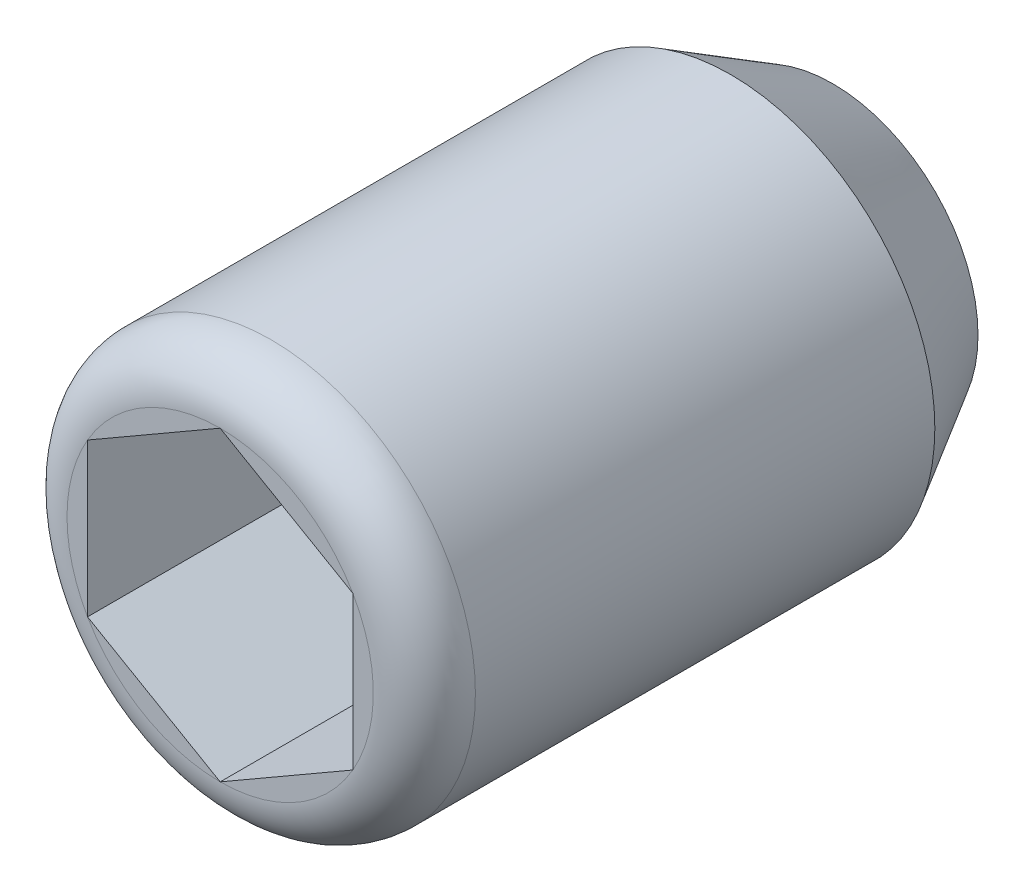
ISO-10303-21;
HEADER;
FILE_DESCRIPTION(('STEP AP214'),'2;1');
FILE_NAME('part.step','',(''),(''),'','','');
FILE_SCHEMA(('AUTOMOTIVE_DESIGN { 1 0 10303 214 1 1 1 1 }'));
ENDSEC;
DATA;
#1=APPLICATION_CONTEXT('core data for automotive mechanical design processes');
#2=APPLICATION_PROTOCOL_DEFINITION('international standard','automotive_design',2000,#1);
#3=PRODUCT_CONTEXT('',#1,'mechanical');
#4=PRODUCT('Part','Part','',(#3));
#5=PRODUCT_RELATED_PRODUCT_CATEGORY('part','',(#4));
#6=PRODUCT_DEFINITION_FORMATION('','',#4);
#7=PRODUCT_DEFINITION_CONTEXT('part definition',#1,'design');
#8=PRODUCT_DEFINITION('design','',#6,#7);
#9=PRODUCT_DEFINITION_SHAPE('','',#8);
#10=(LENGTH_UNIT() NAMED_UNIT(*) SI_UNIT(.MILLI.,.METRE.));
#11=(NAMED_UNIT(*) PLANE_ANGLE_UNIT() SI_UNIT($,.RADIAN.));
#12=(NAMED_UNIT(*) SI_UNIT($,.STERADIAN.) SOLID_ANGLE_UNIT());
#13=UNCERTAINTY_MEASURE_WITH_UNIT(LENGTH_MEASURE(1.E-05),#10,'distance_accuracy_value','');
#14=(GEOMETRIC_REPRESENTATION_CONTEXT(3) GLOBAL_UNCERTAINTY_ASSIGNED_CONTEXT((#13)) GLOBAL_UNIT_ASSIGNED_CONTEXT((#10,
#11,#12)) REPRESENTATION_CONTEXT('',''));
#15=CARTESIAN_POINT('',(0.,0.,0.));
#16=DIRECTION('',(0.,0.,1.));
#17=DIRECTION('',(1.,0.,0.));
#18=AXIS2_PLACEMENT_3D('',#15,#16,#17);
#19=CARTESIAN_POINT('',(0.,0.,6.));
#20=DIRECTION('',(0.,0.,-1.));
#21=DIRECTION('',(0.,-1.,0.));
#22=AXIS2_PLACEMENT_3D('',#19,#20,#21);
#23=PLANE('',#22);
#24=DIRECTION('',(-0.866025403784439,0.5,0.));
#25=VECTOR('',#24,1.);
#26=CARTESIAN_POINT('',(1.29903810567666,0.75,6.));
#27=LINE('',#26,#25);
#28=CARTESIAN_POINT('',(1.29903810567666,0.75,6.));
#29=VERTEX_POINT('',#28);
#30=CARTESIAN_POINT('',(0.,1.5,6.));
#31=VERTEX_POINT('',#30);
#32=EDGE_CURVE('E39',#29,#31,#27,.T.);
#33=ORIENTED_EDGE('',*,*,#32,.F.);
#34=CARTESIAN_POINT('',(0.,0.,6.));
#35=DIRECTION('',(0.,0.,1.));
#36=DIRECTION('',(-1.,0.,0.));
#37=AXIS2_PLACEMENT_3D('',#34,#35,#36);
#38=CIRCLE('',#37,1.5);
#39=EDGE_CURVE('E11',#29,#31,#38,.T.);
#40=ORIENTED_EDGE('',*,*,#39,.T.);
#41=EDGE_LOOP('',(#33,#40));
#42=FACE_BOUND('',#41,.T.);
#43=ADVANCED_FACE('F17',(#42),#23,.F.);
#44=CARTESIAN_POINT('',(0.,0.,6.));
#45=DIRECTION('',(0.,0.,-1.));
#46=DIRECTION('',(0.,-1.,0.));
#47=AXIS2_PLACEMENT_3D('',#44,#45,#46);
#48=PLANE('',#47);
#49=DIRECTION('',(-0.866025403784439,-0.5,0.));
#50=VECTOR('',#49,1.);
#51=CARTESIAN_POINT('',(0.,1.5,6.));
#52=LINE('',#51,#50);
#53=CARTESIAN_POINT('',(-1.29903810567665,0.75,6.));
#54=VERTEX_POINT('',#53);
#55=EDGE_CURVE('E163',#31,#54,#52,.T.);
#56=ORIENTED_EDGE('',*,*,#55,.F.);
#57=CARTESIAN_POINT('',(0.,0.,6.));
#58=DIRECTION('',(0.,0.,1.));
#59=DIRECTION('',(-1.,0.,0.));
#60=AXIS2_PLACEMENT_3D('',#57,#58,#59);
#61=CIRCLE('',#60,1.5);
#62=EDGE_CURVE('E21',#31,#54,#61,.T.);
#63=ORIENTED_EDGE('',*,*,#62,.T.);
#64=EDGE_LOOP('',(#56,#63));
#65=FACE_BOUND('',#64,.T.);
#66=ADVANCED_FACE('F221',(#65),#48,.F.);
#67=CARTESIAN_POINT('',(0.,0.,6.));
#68=DIRECTION('',(0.,0.,-1.));
#69=DIRECTION('',(0.,-1.,0.));
#70=AXIS2_PLACEMENT_3D('',#67,#68,#69);
#71=PLANE('',#70);
#72=DIRECTION('',(0.,-1.,0.));
#73=VECTOR('',#72,1.);
#74=CARTESIAN_POINT('',(-1.29903810567665,0.75,6.));
#75=LINE('',#74,#73);
#76=CARTESIAN_POINT('',(-1.29903810567665,-0.75,6.));
#77=VERTEX_POINT('',#76);
#78=EDGE_CURVE('E176',#54,#77,#75,.T.);
#79=ORIENTED_EDGE('',*,*,#78,.F.);
#80=CARTESIAN_POINT('',(0.,0.,6.));
#81=DIRECTION('',(0.,0.,1.));
#82=DIRECTION('',(-1.,0.,0.));
#83=AXIS2_PLACEMENT_3D('',#80,#81,#82);
#84=CIRCLE('',#83,1.5);
#85=EDGE_CURVE('E166',#54,#77,#84,.T.);
#86=ORIENTED_EDGE('',*,*,#85,.T.);
#87=EDGE_LOOP('',(#79,#86));
#88=FACE_BOUND('',#87,.T.);
#89=ADVANCED_FACE('F226',(#88),#71,.F.);
#90=CARTESIAN_POINT('',(0.,0.,6.));
#91=DIRECTION('',(0.,0.,-1.));
#92=DIRECTION('',(0.,-1.,0.));
#93=AXIS2_PLACEMENT_3D('',#90,#91,#92);
#94=PLANE('',#93);
#95=DIRECTION('',(0.866025403784439,-0.5,0.));
#96=VECTOR('',#95,1.);
#97=CARTESIAN_POINT('',(-1.29903810567665,-0.75,6.));
#98=LINE('',#97,#96);
#99=CARTESIAN_POINT('',(0.,-1.5,6.));
#100=VERTEX_POINT('',#99);
#101=EDGE_CURVE('E151',#77,#100,#98,.T.);
#102=ORIENTED_EDGE('',*,*,#101,.F.);
#103=CARTESIAN_POINT('',(0.,0.,6.));
#104=DIRECTION('',(0.,0.,1.));
#105=DIRECTION('',(-1.,0.,0.));
#106=AXIS2_PLACEMENT_3D('',#103,#104,#105);
#107=CIRCLE('',#106,1.5);
#108=EDGE_CURVE('E158',#77,#100,#107,.T.);
#109=ORIENTED_EDGE('',*,*,#108,.T.);
#110=EDGE_LOOP('',(#102,#109));
#111=FACE_BOUND('',#110,.T.);
#112=ADVANCED_FACE('F232',(#111),#94,.F.);
#113=CARTESIAN_POINT('',(0.,0.,6.));
#114=DIRECTION('',(0.,0.,-1.));
#115=DIRECTION('',(0.,-1.,0.));
#116=AXIS2_PLACEMENT_3D('',#113,#114,#115);
#117=PLANE('',#116);
#118=DIRECTION('',(0.866025403784438,0.5,0.));
#119=VECTOR('',#118,1.);
#120=CARTESIAN_POINT('',(0.,-1.5,6.));
#121=LINE('',#120,#119);
#122=CARTESIAN_POINT('',(1.29903810567666,-0.75,6.));
#123=VERTEX_POINT('',#122);
#124=EDGE_CURVE('E126',#100,#123,#121,.T.);
#125=ORIENTED_EDGE('',*,*,#124,.F.);
#126=CARTESIAN_POINT('',(0.,0.,6.));
#127=DIRECTION('',(0.,0.,1.));
#128=DIRECTION('',(-1.,0.,0.));
#129=AXIS2_PLACEMENT_3D('',#126,#127,#128);
#130=CIRCLE('',#129,1.5);
#131=EDGE_CURVE('E154',#100,#123,#130,.T.);
#132=ORIENTED_EDGE('',*,*,#131,.T.);
#133=EDGE_LOOP('',(#125,#132));
#134=FACE_BOUND('',#133,.T.);
#135=ADVANCED_FACE('F234',(#134),#117,.F.);
#136=CARTESIAN_POINT('',(0.,0.,6.));
#137=DIRECTION('',(0.,0.,-1.));
#138=DIRECTION('',(-1.,0.,0.));
#139=AXIS2_PLACEMENT_3D('',#136,#137,#138);
#140=CYLINDRICAL_SURFACE('',#139,2.);
#141=CARTESIAN_POINT('',(0.,0.,5.5));
#142=DIRECTION('',(0.,0.,-1.));
#143=DIRECTION('',(-1.,0.,0.));
#144=AXIS2_PLACEMENT_3D('',#141,#142,#143);
#145=CIRCLE('',#144,2.);
#146=CARTESIAN_POINT('',(-2.,0.,5.5));
#147=VERTEX_POINT('',#146);
#148=EDGE_CURVE('E107',#147,#147,#145,.T.);
#149=ORIENTED_EDGE('',*,*,#148,.T.);
#150=EDGE_LOOP('',(#149));
#151=FACE_BOUND('',#150,.T.);
#152=CARTESIAN_POINT('',(0.,0.,1.));
#153=DIRECTION('',(0.,0.,1.));
#154=DIRECTION('',(-1.,0.,0.));
#155=AXIS2_PLACEMENT_3D('',#152,#153,#154);
#156=CIRCLE('',#155,2.);
#157=CARTESIAN_POINT('',(-2.,0.,1.));
#158=VERTEX_POINT('',#157);
#159=EDGE_CURVE('E131',#158,#158,#156,.T.);
#160=ORIENTED_EDGE('',*,*,#159,.T.);
#161=EDGE_LOOP('',(#160));
#162=FACE_BOUND('',#161,.T.);
#163=ADVANCED_FACE('F19',(#151,#162),#140,.T.);
#164=CARTESIAN_POINT('',(0.,0.,6.));
#165=DIRECTION('',(0.,0.,-1.));
#166=DIRECTION('',(0.,-1.,0.));
#167=AXIS2_PLACEMENT_3D('',#164,#165,#166);
#168=PLANE('',#167);
#169=DIRECTION('',(0.,1.,0.));
#170=VECTOR('',#169,1.);
#171=CARTESIAN_POINT('',(1.29903810567666,-0.75,6.));
#172=LINE('',#171,#170);
#173=EDGE_CURVE('E98',#123,#29,#172,.T.);
#174=ORIENTED_EDGE('',*,*,#173,.F.);
#175=CARTESIAN_POINT('',(0.,0.,6.));
#176=DIRECTION('',(0.,0.,1.));
#177=DIRECTION('',(-1.,0.,0.));
#178=AXIS2_PLACEMENT_3D('',#175,#176,#177);
#179=CIRCLE('',#178,1.5);
#180=EDGE_CURVE('E125',#123,#29,#179,.T.);
#181=ORIENTED_EDGE('',*,*,#180,.T.);
#182=EDGE_LOOP('',(#174,#181));
#183=FACE_BOUND('',#182,.T.);
#184=ADVANCED_FACE('F217',(#183),#168,.F.);
#185=CARTESIAN_POINT('',(0.,0.,0.));
#186=DIRECTION('',(0.,0.,-1.));
#187=DIRECTION('',(0.,-1.,0.));
#188=AXIS2_PLACEMENT_3D('',#185,#186,#187);
#189=PLANE('',#188);
#190=CARTESIAN_POINT('',(0.,0.,0.));
#191=DIRECTION('',(0.,0.,-1.));
#192=DIRECTION('',(-1.,0.,0.));
#193=AXIS2_PLACEMENT_3D('',#190,#191,#192);
#194=CIRCLE('',#193,1.42264973081037);
#195=CARTESIAN_POINT('',(-1.42264973081037,0.,0.));
#196=VERTEX_POINT('',#195);
#197=EDGE_CURVE('E121',#196,#196,#194,.T.);
#198=ORIENTED_EDGE('',*,*,#197,.T.);
#199=EDGE_LOOP('',(#198));
#200=FACE_BOUND('',#199,.T.);
#201=ADVANCED_FACE('F209',(#200),#189,.T.);
#202=CARTESIAN_POINT('',(0.,0.,0.));
#203=DIRECTION('',(0.,0.,1.));
#204=DIRECTION('',(1.,0.,0.));
#205=AXIS2_PLACEMENT_3D('',#202,#203,#204);
#206=CONICAL_SURFACE('',#205,1.42264973081037,0.523598775598299);
#207=ORIENTED_EDGE('',*,*,#159,.F.);
#208=EDGE_LOOP('',(#207));
#209=FACE_BOUND('',#208,.T.);
#210=ORIENTED_EDGE('',*,*,#197,.F.);
#211=EDGE_LOOP('',(#210));
#212=FACE_BOUND('',#211,.T.);
#213=ADVANCED_FACE('F122',(#209,#212),#206,.T.);
#214=CARTESIAN_POINT('',(0.,-1.5,3.));
#215=DIRECTION('',(0.5,-0.866025403784438,0.));
#216=DIRECTION('',(0.,0.,-1.));
#217=AXIS2_PLACEMENT_3D('',#214,#215,#216);
#218=PLANE('',#217);
#219=ORIENTED_EDGE('',*,*,#124,.T.);
#220=DIRECTION('',(0.,0.,1.));
#221=VECTOR('',#220,1.);
#222=CARTESIAN_POINT('',(1.29903810567666,-0.75,3.));
#223=LINE('',#222,#221);
#224=CARTESIAN_POINT('',(1.29903810567666,-0.75,3.));
#225=VERTEX_POINT('',#224);
#226=EDGE_CURVE('E140',#225,#123,#223,.T.);
#227=ORIENTED_EDGE('',*,*,#226,.F.);
#228=DIRECTION('',(0.866025403784438,0.5,0.));
#229=VECTOR('',#228,1.);
#230=CARTESIAN_POINT('',(0.,-1.5,3.));
#231=LINE('',#230,#229);
#232=CARTESIAN_POINT('',(0.,-1.5,3.));
#233=VERTEX_POINT('',#232);
#234=EDGE_CURVE('E114',#233,#225,#231,.T.);
#235=ORIENTED_EDGE('',*,*,#234,.F.);
#236=DIRECTION('',(0.,0.,1.));
#237=VECTOR('',#236,1.);
#238=CARTESIAN_POINT('',(0.,-1.5,3.));
#239=LINE('',#238,#237);
#240=EDGE_CURVE('E134',#233,#100,#239,.T.);
#241=ORIENTED_EDGE('',*,*,#240,.T.);
#242=EDGE_LOOP('',(#219,#227,#235,#241));
#243=FACE_BOUND('',#242,.T.);
#244=ADVANCED_FACE('F208',(#243),#218,.F.);
#245=CARTESIAN_POINT('',(1.29903810567666,-0.75,3.));
#246=DIRECTION('',(1.,0.,0.));
#247=DIRECTION('',(0.,1.,0.));
#248=AXIS2_PLACEMENT_3D('',#245,#246,#247);
#249=PLANE('',#248);
#250=ORIENTED_EDGE('',*,*,#173,.T.);
#251=DIRECTION('',(0.,0.,1.));
#252=VECTOR('',#251,1.);
#253=CARTESIAN_POINT('',(1.29903810567666,0.75,3.));
#254=LINE('',#253,#252);
#255=CARTESIAN_POINT('',(1.29903810567666,0.75,3.));
#256=VERTEX_POINT('',#255);
#257=EDGE_CURVE('E159',#256,#29,#254,.T.);
#258=ORIENTED_EDGE('',*,*,#257,.F.);
#259=DIRECTION('',(0.,1.,0.));
#260=VECTOR('',#259,1.);
#261=CARTESIAN_POINT('',(1.29903810567666,-0.75,3.));
#262=LINE('',#261,#260);
#263=EDGE_CURVE('E139',#225,#256,#262,.T.);
#264=ORIENTED_EDGE('',*,*,#263,.F.);
#265=ORIENTED_EDGE('',*,*,#226,.T.);
#266=EDGE_LOOP('',(#250,#258,#264,#265));
#267=FACE_BOUND('',#266,.T.);
#268=ADVANCED_FACE('F214',(#267),#249,.F.);
#269=CARTESIAN_POINT('',(1.29903810567666,0.75,3.));
#270=DIRECTION('',(0.5,0.866025403784439,0.));
#271=DIRECTION('',(0.,0.,-1.));
#272=AXIS2_PLACEMENT_3D('',#269,#270,#271);
#273=PLANE('',#272);
#274=ORIENTED_EDGE('',*,*,#32,.T.);
#275=DIRECTION('',(0.,0.,1.));
#276=VECTOR('',#275,1.);
#277=CARTESIAN_POINT('',(0.,1.5,3.));
#278=LINE('',#277,#276);
#279=CARTESIAN_POINT('',(0.,1.5,3.));
#280=VERTEX_POINT('',#279);
#281=EDGE_CURVE('E183',#280,#31,#278,.T.);
#282=ORIENTED_EDGE('',*,*,#281,.F.);
#283=DIRECTION('',(-0.866025403784439,0.5,0.));
#284=VECTOR('',#283,1.);
#285=CARTESIAN_POINT('',(1.29903810567666,0.75,3.));
#286=LINE('',#285,#284);
#287=EDGE_CURVE('E90',#256,#280,#286,.T.);
#288=ORIENTED_EDGE('',*,*,#287,.F.);
#289=ORIENTED_EDGE('',*,*,#257,.T.);
#290=EDGE_LOOP('',(#274,#282,#288,#289));
#291=FACE_BOUND('',#290,.T.);
#292=ADVANCED_FACE('F268',(#291),#273,.F.);
#293=CARTESIAN_POINT('',(0.,1.5,3.));
#294=DIRECTION('',(-0.5,0.866025403784439,0.));
#295=DIRECTION('',(0.,0.,1.));
#296=AXIS2_PLACEMENT_3D('',#293,#294,#295);
#297=PLANE('',#296);
#298=ORIENTED_EDGE('',*,*,#55,.T.);
#299=DIRECTION('',(0.,0.,1.));
#300=VECTOR('',#299,1.);
#301=CARTESIAN_POINT('',(-1.29903810567665,0.75,3.));
#302=LINE('',#301,#300);
#303=CARTESIAN_POINT('',(-1.29903810567665,0.75,3.));
#304=VERTEX_POINT('',#303);
#305=EDGE_CURVE('E173',#304,#54,#302,.T.);
#306=ORIENTED_EDGE('',*,*,#305,.F.);
#307=DIRECTION('',(-0.866025403784439,-0.5,0.));
#308=VECTOR('',#307,1.);
#309=CARTESIAN_POINT('',(0.,1.5,3.));
#310=LINE('',#309,#308);
#311=EDGE_CURVE('E84',#280,#304,#310,.T.);
#312=ORIENTED_EDGE('',*,*,#311,.F.);
#313=ORIENTED_EDGE('',*,*,#281,.T.);
#314=EDGE_LOOP('',(#298,#306,#312,#313));
#315=FACE_BOUND('',#314,.T.);
#316=ADVANCED_FACE('F266',(#315),#297,.F.);
#317=CARTESIAN_POINT('',(-1.29903810567665,0.75,3.));
#318=DIRECTION('',(-1.,0.,0.));
#319=DIRECTION('',(0.,1.,0.));
#320=AXIS2_PLACEMENT_3D('',#317,#318,#319);
#321=PLANE('',#320);
#322=ORIENTED_EDGE('',*,*,#78,.T.);
#323=DIRECTION('',(0.,0.,1.));
#324=VECTOR('',#323,1.);
#325=CARTESIAN_POINT('',(-1.29903810567665,-0.75,3.));
#326=LINE('',#325,#324);
#327=CARTESIAN_POINT('',(-1.29903810567665,-0.75,3.));
#328=VERTEX_POINT('',#327);
#329=EDGE_CURVE('E138',#328,#77,#326,.T.);
#330=ORIENTED_EDGE('',*,*,#329,.F.);
#331=DIRECTION('',(0.,-1.,0.));
#332=VECTOR('',#331,1.);
#333=CARTESIAN_POINT('',(-1.29903810567665,0.75,3.));
#334=LINE('',#333,#332);
#335=EDGE_CURVE('E78',#304,#328,#334,.T.);
#336=ORIENTED_EDGE('',*,*,#335,.F.);
#337=ORIENTED_EDGE('',*,*,#305,.T.);
#338=EDGE_LOOP('',(#322,#330,#336,#337));
#339=FACE_BOUND('',#338,.T.);
#340=ADVANCED_FACE('F248',(#339),#321,.F.);
#341=CARTESIAN_POINT('',(-1.29903810567665,-0.75,3.));
#342=DIRECTION('',(-0.5,-0.866025403784439,0.));
#343=DIRECTION('',(-0.866025403784439,0.5,0.));
#344=AXIS2_PLACEMENT_3D('',#341,#342,#343);
#345=PLANE('',#344);
#346=ORIENTED_EDGE('',*,*,#101,.T.);
#347=ORIENTED_EDGE('',*,*,#240,.F.);
#348=DIRECTION('',(0.866025403784439,-0.5,0.));
#349=VECTOR('',#348,1.);
#350=CARTESIAN_POINT('',(-1.29903810567665,-0.75,3.));
#351=LINE('',#350,#349);
#352=EDGE_CURVE('E178',#328,#233,#351,.T.);
#353=ORIENTED_EDGE('',*,*,#352,.F.);
#354=ORIENTED_EDGE('',*,*,#329,.T.);
#355=EDGE_LOOP('',(#346,#347,#353,#354));
#356=FACE_BOUND('',#355,.T.);
#357=ADVANCED_FACE('F257',(#356),#345,.F.);
#358=CARTESIAN_POINT('',(0.,0.,3.));
#359=DIRECTION('',(0.,0.,1.));
#360=DIRECTION('',(1.,0.,0.));
#361=AXIS2_PLACEMENT_3D('',#358,#359,#360);
#362=PLANE('',#361);
#363=ORIENTED_EDGE('',*,*,#234,.T.);
#364=ORIENTED_EDGE('',*,*,#263,.T.);
#365=ORIENTED_EDGE('',*,*,#287,.T.);
#366=ORIENTED_EDGE('',*,*,#311,.T.);
#367=ORIENTED_EDGE('',*,*,#335,.T.);
#368=ORIENTED_EDGE('',*,*,#352,.T.);
#369=EDGE_LOOP('',(#363,#364,#365,#366,#367,#368));
#370=FACE_BOUND('',#369,.T.);
#371=ADVANCED_FACE('F230',(#370),#362,.T.);
#372=CARTESIAN_POINT('',(0.,0.,5.5));
#373=DIRECTION('',(0.,0.,-1.));
#374=DIRECTION('',(-1.,0.,0.));
#375=AXIS2_PLACEMENT_3D('',#372,#373,#374);
#376=TOROIDAL_SURFACE('',#375,1.5,0.5);
#377=ORIENTED_EDGE('',*,*,#62,.F.);
#378=ORIENTED_EDGE('',*,*,#39,.F.);
#379=ORIENTED_EDGE('',*,*,#180,.F.);
#380=ORIENTED_EDGE('',*,*,#131,.F.);
#381=ORIENTED_EDGE('',*,*,#108,.F.);
#382=ORIENTED_EDGE('',*,*,#85,.F.);
#383=EDGE_LOOP('',(#377,#378,#379,#380,#381,#382));
#384=FACE_BOUND('',#383,.T.);
#385=ORIENTED_EDGE('',*,*,#148,.F.);
#386=EDGE_LOOP('',(#385));
#387=FACE_BOUND('',#386,.T.);
#388=ADVANCED_FACE('F254',(#384,#387),#376,.T.);
#389=CLOSED_SHELL('',(#43,#66,#89,#112,#135,#163,#184,#201,#213,#244,#268,#292,#316,#340,#357,
#371,#388));
#390=MANIFOLD_SOLID_BREP('B1',#389);
#391=ADVANCED_BREP_SHAPE_REPRESENTATION('',(#18,#390),#14);
#392=SHAPE_DEFINITION_REPRESENTATION(#9,#391);
ENDSEC;
END-ISO-10303-21;
